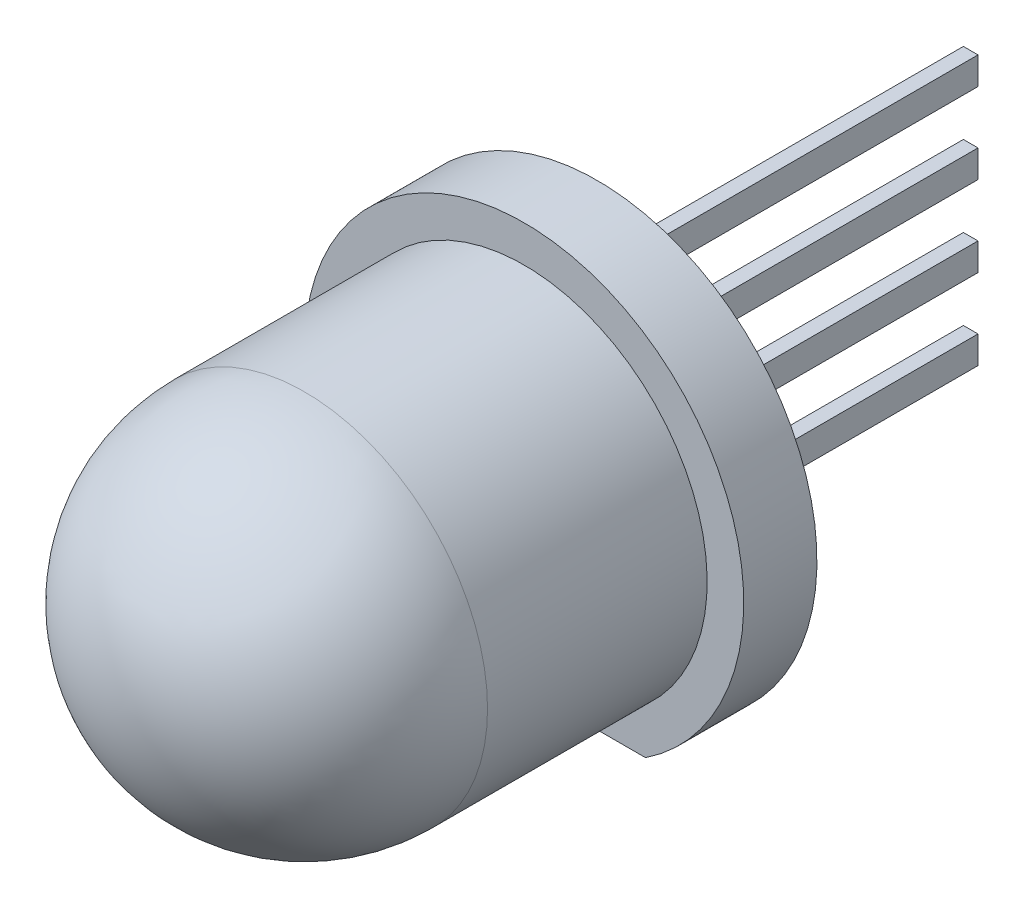
ISO-10303-21;
HEADER;
FILE_DESCRIPTION(('STEP AP214'),'2;1');
FILE_NAME('part.step','',(''),(''),'','','');
FILE_SCHEMA(('AUTOMOTIVE_DESIGN { 1 0 10303 214 1 1 1 1 }'));
ENDSEC;
DATA;
#1=APPLICATION_CONTEXT('core data for automotive mechanical design processes');
#2=APPLICATION_PROTOCOL_DEFINITION('international standard','automotive_design',2000,#1);
#3=PRODUCT_CONTEXT('',#1,'mechanical');
#4=PRODUCT('Part','Part','',(#3));
#5=PRODUCT_RELATED_PRODUCT_CATEGORY('part','',(#4));
#6=PRODUCT_DEFINITION_FORMATION('','',#4);
#7=PRODUCT_DEFINITION_CONTEXT('part definition',#1,'design');
#8=PRODUCT_DEFINITION('design','',#6,#7);
#9=PRODUCT_DEFINITION_SHAPE('','',#8);
#10=(LENGTH_UNIT() NAMED_UNIT(*) SI_UNIT(.MILLI.,.METRE.));
#11=(NAMED_UNIT(*) PLANE_ANGLE_UNIT() SI_UNIT($,.RADIAN.));
#12=(NAMED_UNIT(*) SI_UNIT($,.STERADIAN.) SOLID_ANGLE_UNIT());
#13=UNCERTAINTY_MEASURE_WITH_UNIT(LENGTH_MEASURE(1.E-05),#10,'distance_accuracy_value','');
#14=(GEOMETRIC_REPRESENTATION_CONTEXT(3) GLOBAL_UNCERTAINTY_ASSIGNED_CONTEXT((#13)) GLOBAL_UNIT_ASSIGNED_CONTEXT((#10,
#11,#12)) REPRESENTATION_CONTEXT('',''));
#15=CARTESIAN_POINT('',(0.,0.,0.));
#16=DIRECTION('',(0.,0.,1.));
#17=DIRECTION('',(1.,0.,0.));
#18=AXIS2_PLACEMENT_3D('',#15,#16,#17);
#19=CARTESIAN_POINT('',(0.4,-2.43182394241055,-12.));
#20=DIRECTION('',(-1.,0.,0.));
#21=DIRECTION('',(0.,0.,1.));
#22=AXIS2_PLACEMENT_3D('',#19,#20,#21);
#23=PLANE('',#22);
#24=DIRECTION('',(0.,-1.,0.));
#25=VECTOR('',#24,1.);
#26=CARTESIAN_POINT('',(0.4,-2.43182394241055,-2.));
#27=LINE('',#26,#25);
#28=CARTESIAN_POINT('',(0.4,-2.43182394241055,-2.));
#29=VERTEX_POINT('',#28);
#30=CARTESIAN_POINT('',(0.4,-3.18182394241055,-2.));
#31=VERTEX_POINT('',#30);
#32=EDGE_CURVE('E107',#29,#31,#27,.T.);
#33=ORIENTED_EDGE('',*,*,#32,.T.);
#34=DIRECTION('',(0.,0.,1.));
#35=VECTOR('',#34,1.);
#36=CARTESIAN_POINT('',(0.4,-3.18182394241055,-12.));
#37=LINE('',#36,#35);
#38=CARTESIAN_POINT('',(0.4,-3.18182394241055,-12.));
#39=VERTEX_POINT('',#38);
#40=EDGE_CURVE('E12',#39,#31,#37,.T.);
#41=ORIENTED_EDGE('',*,*,#40,.F.);
#42=DIRECTION('',(0.,-1.,0.));
#43=VECTOR('',#42,1.);
#44=CARTESIAN_POINT('',(0.4,-2.43182394241055,-12.));
#45=LINE('',#44,#43);
#46=CARTESIAN_POINT('',(0.4,-2.43182394241055,-12.));
#47=VERTEX_POINT('',#46);
#48=EDGE_CURVE('E95',#47,#39,#45,.T.);
#49=ORIENTED_EDGE('',*,*,#48,.F.);
#50=DIRECTION('',(0.,0.,1.));
#51=VECTOR('',#50,1.);
#52=CARTESIAN_POINT('',(0.4,-2.43182394241055,-12.));
#53=LINE('',#52,#51);
#54=EDGE_CURVE('E103',#47,#29,#53,.T.);
#55=ORIENTED_EDGE('',*,*,#54,.T.);
#56=EDGE_LOOP('',(#33,#41,#49,#55));
#57=FACE_BOUND('',#56,.T.);
#58=ADVANCED_FACE('F44',(#57),#23,.F.);
#59=CARTESIAN_POINT('',(0.4,-3.18182394241055,-12.));
#60=DIRECTION('',(0.,1.,0.));
#61=DIRECTION('',(0.,0.,1.));
#62=AXIS2_PLACEMENT_3D('',#59,#60,#61);
#63=PLANE('',#62);
#64=DIRECTION('',(-1.,0.,0.));
#65=VECTOR('',#64,1.);
#66=CARTESIAN_POINT('',(0.4,-3.18182394241055,-2.));
#67=LINE('',#66,#65);
#68=CARTESIAN_POINT('',(0.,-3.18182394241055,-2.));
#69=VERTEX_POINT('',#68);
#70=EDGE_CURVE('E99',#31,#69,#67,.T.);
#71=ORIENTED_EDGE('',*,*,#70,.T.);
#72=DIRECTION('',(0.,0.,1.));
#73=VECTOR('',#72,1.);
#74=CARTESIAN_POINT('',(0.,-3.18182394241055,-12.));
#75=LINE('',#74,#73);
#76=CARTESIAN_POINT('',(0.,-3.18182394241055,-12.));
#77=VERTEX_POINT('',#76);
#78=EDGE_CURVE('E52',#77,#69,#75,.T.);
#79=ORIENTED_EDGE('',*,*,#78,.F.);
#80=DIRECTION('',(-1.,0.,0.));
#81=VECTOR('',#80,1.);
#82=CARTESIAN_POINT('',(0.4,-3.18182394241055,-12.));
#83=LINE('',#82,#81);
#84=EDGE_CURVE('E90',#39,#77,#83,.T.);
#85=ORIENTED_EDGE('',*,*,#84,.F.);
#86=ORIENTED_EDGE('',*,*,#40,.T.);
#87=EDGE_LOOP('',(#71,#79,#85,#86));
#88=FACE_BOUND('',#87,.T.);
#89=ADVANCED_FACE('F98',(#88),#63,.F.);
#90=CARTESIAN_POINT('',(0.,-2.43182394241055,-12.));
#91=DIRECTION('',(1.,0.,0.));
#92=DIRECTION('',(0.,0.,-1.));
#93=AXIS2_PLACEMENT_3D('',#90,#91,#92);
#94=PLANE('',#93);
#95=DIRECTION('',(0.,1.,0.));
#96=VECTOR('',#95,1.);
#97=CARTESIAN_POINT('',(0.,-2.43182394241055,-2.));
#98=LINE('',#97,#96);
#99=CARTESIAN_POINT('',(0.,-2.43182394241055,-2.));
#100=VERTEX_POINT('',#99);
#101=EDGE_CURVE('E77',#69,#100,#98,.T.);
#102=ORIENTED_EDGE('',*,*,#101,.T.);
#103=DIRECTION('',(0.,0.,1.));
#104=VECTOR('',#103,1.);
#105=CARTESIAN_POINT('',(0.,-2.43182394241055,-12.));
#106=LINE('',#105,#104);
#107=CARTESIAN_POINT('',(0.,-2.43182394241055,-12.));
#108=VERTEX_POINT('',#107);
#109=EDGE_CURVE('E100',#108,#100,#106,.T.);
#110=ORIENTED_EDGE('',*,*,#109,.F.);
#111=DIRECTION('',(0.,1.,0.));
#112=VECTOR('',#111,1.);
#113=CARTESIAN_POINT('',(0.,-2.43182394241055,-12.));
#114=LINE('',#113,#112);
#115=EDGE_CURVE('E93',#77,#108,#114,.T.);
#116=ORIENTED_EDGE('',*,*,#115,.F.);
#117=ORIENTED_EDGE('',*,*,#78,.T.);
#118=EDGE_LOOP('',(#102,#110,#116,#117));
#119=FACE_BOUND('',#118,.T.);
#120=ADVANCED_FACE('F101',(#119),#94,.F.);
#121=CARTESIAN_POINT('',(0.4,-2.43182394241055,-12.));
#122=DIRECTION('',(0.,-1.,0.));
#123=DIRECTION('',(0.,0.,-1.));
#124=AXIS2_PLACEMENT_3D('',#121,#122,#123);
#125=PLANE('',#124);
#126=DIRECTION('',(1.,0.,0.));
#127=VECTOR('',#126,1.);
#128=CARTESIAN_POINT('',(0.4,-2.43182394241055,-2.));
#129=LINE('',#128,#127);
#130=EDGE_CURVE('E83',#100,#29,#129,.T.);
#131=ORIENTED_EDGE('',*,*,#130,.T.);
#132=ORIENTED_EDGE('',*,*,#54,.F.);
#133=DIRECTION('',(1.,0.,0.));
#134=VECTOR('',#133,1.);
#135=CARTESIAN_POINT('',(0.4,-2.43182394241055,-12.));
#136=LINE('',#135,#134);
#137=EDGE_CURVE('E60',#108,#47,#136,.T.);
#138=ORIENTED_EDGE('',*,*,#137,.F.);
#139=ORIENTED_EDGE('',*,*,#109,.T.);
#140=EDGE_LOOP('',(#131,#132,#138,#139));
#141=FACE_BOUND('',#140,.T.);
#142=ADVANCED_FACE('F114',(#141),#125,.F.);
#143=CARTESIAN_POINT('',(0.,0.,-12.));
#144=DIRECTION('',(0.,0.,-1.));
#145=DIRECTION('',(-1.,0.,0.));
#146=AXIS2_PLACEMENT_3D('',#143,#144,#145);
#147=PLANE('',#146);
#148=ORIENTED_EDGE('',*,*,#48,.T.);
#149=ORIENTED_EDGE('',*,*,#84,.T.);
#150=ORIENTED_EDGE('',*,*,#115,.T.);
#151=ORIENTED_EDGE('',*,*,#137,.T.);
#152=EDGE_LOOP('',(#148,#149,#150,#151));
#153=FACE_BOUND('',#152,.T.);
#154=ADVANCED_FACE('F91',(#153),#147,.T.);
#155=CARTESIAN_POINT('',(0.,0.,-2.));
#156=DIRECTION('',(0.,0.,-1.));
#157=DIRECTION('',(-1.,0.,0.));
#158=AXIS2_PLACEMENT_3D('',#155,#156,#157);
#159=PLANE('',#158);
#160=ORIENTED_EDGE('',*,*,#32,.F.);
#161=ORIENTED_EDGE('',*,*,#130,.F.);
#162=ORIENTED_EDGE('',*,*,#101,.F.);
#163=ORIENTED_EDGE('',*,*,#70,.F.);
#164=EDGE_LOOP('',(#160,#161,#162,#163));
#165=FACE_BOUND('',#164,.T.);
#166=ADVANCED_FACE('F117',(#165),#159,.F.);
#167=CLOSED_SHELL('',(#58,#89,#120,#142,#154,#166));
#168=MANIFOLD_SOLID_BREP('B2',#167);
#169=CARTESIAN_POINT('',(0.4,-0.230930300584403,-12.));
#170=DIRECTION('',(-1.,0.,0.));
#171=DIRECTION('',(0.,0.,1.));
#172=AXIS2_PLACEMENT_3D('',#169,#170,#171);
#173=PLANE('',#172);
#174=DIRECTION('',(0.,-1.,0.));
#175=VECTOR('',#174,1.);
#176=CARTESIAN_POINT('',(0.4,-0.230930300584403,-2.));
#177=LINE('',#176,#175);
#178=CARTESIAN_POINT('',(0.4,-0.230930300584403,-2.));
#179=VERTEX_POINT('',#178);
#180=CARTESIAN_POINT('',(0.4,-0.980930300584403,-2.));
#181=VERTEX_POINT('',#180);
#182=EDGE_CURVE('E241',#179,#181,#177,.T.);
#183=ORIENTED_EDGE('',*,*,#182,.T.);
#184=DIRECTION('',(0.,0.,1.));
#185=VECTOR('',#184,1.);
#186=CARTESIAN_POINT('',(0.4,-0.980930300584403,-12.));
#187=LINE('',#186,#185);
#188=CARTESIAN_POINT('',(0.4,-0.980930300584403,-12.));
#189=VERTEX_POINT('',#188);
#190=EDGE_CURVE('E42',#189,#181,#187,.T.);
#191=ORIENTED_EDGE('',*,*,#190,.F.);
#192=DIRECTION('',(0.,-1.,0.));
#193=VECTOR('',#192,1.);
#194=CARTESIAN_POINT('',(0.4,-0.230930300584403,-12.));
#195=LINE('',#194,#193);
#196=CARTESIAN_POINT('',(0.4,-0.230930300584403,-12.));
#197=VERTEX_POINT('',#196);
#198=EDGE_CURVE('E229',#197,#189,#195,.T.);
#199=ORIENTED_EDGE('',*,*,#198,.F.);
#200=DIRECTION('',(0.,0.,1.));
#201=VECTOR('',#200,1.);
#202=CARTESIAN_POINT('',(0.4,-0.230930300584403,-12.));
#203=LINE('',#202,#201);
#204=EDGE_CURVE('E237',#197,#179,#203,.T.);
#205=ORIENTED_EDGE('',*,*,#204,.T.);
#206=EDGE_LOOP('',(#183,#191,#199,#205));
#207=FACE_BOUND('',#206,.T.);
#208=ADVANCED_FACE('F178',(#207),#173,.F.);
#209=CARTESIAN_POINT('',(0.4,-0.980930300584403,-12.));
#210=DIRECTION('',(0.,1.,0.));
#211=DIRECTION('',(0.,0.,1.));
#212=AXIS2_PLACEMENT_3D('',#209,#210,#211);
#213=PLANE('',#212);
#214=DIRECTION('',(-1.,0.,0.));
#215=VECTOR('',#214,1.);
#216=CARTESIAN_POINT('',(0.4,-0.980930300584403,-2.));
#217=LINE('',#216,#215);
#218=CARTESIAN_POINT('',(0.,-0.980930300584403,-2.));
#219=VERTEX_POINT('',#218);
#220=EDGE_CURVE('E233',#181,#219,#217,.T.);
#221=ORIENTED_EDGE('',*,*,#220,.T.);
#222=DIRECTION('',(0.,0.,1.));
#223=VECTOR('',#222,1.);
#224=CARTESIAN_POINT('',(0.,-0.980930300584403,-12.));
#225=LINE('',#224,#223);
#226=CARTESIAN_POINT('',(0.,-0.980930300584403,-12.));
#227=VERTEX_POINT('',#226);
#228=EDGE_CURVE('E186',#227,#219,#225,.T.);
#229=ORIENTED_EDGE('',*,*,#228,.F.);
#230=DIRECTION('',(-1.,0.,0.));
#231=VECTOR('',#230,1.);
#232=CARTESIAN_POINT('',(0.4,-0.980930300584403,-12.));
#233=LINE('',#232,#231);
#234=EDGE_CURVE('E224',#189,#227,#233,.T.);
#235=ORIENTED_EDGE('',*,*,#234,.F.);
#236=ORIENTED_EDGE('',*,*,#190,.T.);
#237=EDGE_LOOP('',(#221,#229,#235,#236));
#238=FACE_BOUND('',#237,.T.);
#239=ADVANCED_FACE('F232',(#238),#213,.F.);
#240=CARTESIAN_POINT('',(0.,-0.230930300584403,-12.));
#241=DIRECTION('',(1.,0.,0.));
#242=DIRECTION('',(0.,0.,-1.));
#243=AXIS2_PLACEMENT_3D('',#240,#241,#242);
#244=PLANE('',#243);
#245=DIRECTION('',(0.,1.,0.));
#246=VECTOR('',#245,1.);
#247=CARTESIAN_POINT('',(0.,-0.230930300584403,-2.));
#248=LINE('',#247,#246);
#249=CARTESIAN_POINT('',(0.,-0.230930300584403,-2.));
#250=VERTEX_POINT('',#249);
#251=EDGE_CURVE('E211',#219,#250,#248,.T.);
#252=ORIENTED_EDGE('',*,*,#251,.T.);
#253=DIRECTION('',(0.,0.,1.));
#254=VECTOR('',#253,1.);
#255=CARTESIAN_POINT('',(0.,-0.230930300584403,-12.));
#256=LINE('',#255,#254);
#257=CARTESIAN_POINT('',(0.,-0.230930300584403,-12.));
#258=VERTEX_POINT('',#257);
#259=EDGE_CURVE('E234',#258,#250,#256,.T.);
#260=ORIENTED_EDGE('',*,*,#259,.F.);
#261=DIRECTION('',(0.,1.,0.));
#262=VECTOR('',#261,1.);
#263=CARTESIAN_POINT('',(0.,-0.230930300584403,-12.));
#264=LINE('',#263,#262);
#265=EDGE_CURVE('E227',#227,#258,#264,.T.);
#266=ORIENTED_EDGE('',*,*,#265,.F.);
#267=ORIENTED_EDGE('',*,*,#228,.T.);
#268=EDGE_LOOP('',(#252,#260,#266,#267));
#269=FACE_BOUND('',#268,.T.);
#270=ADVANCED_FACE('F235',(#269),#244,.F.);
#271=CARTESIAN_POINT('',(0.4,-0.230930300584403,-12.));
#272=DIRECTION('',(0.,-1.,0.));
#273=DIRECTION('',(0.,0.,-1.));
#274=AXIS2_PLACEMENT_3D('',#271,#272,#273);
#275=PLANE('',#274);
#276=DIRECTION('',(1.,0.,0.));
#277=VECTOR('',#276,1.);
#278=CARTESIAN_POINT('',(0.4,-0.230930300584403,-2.));
#279=LINE('',#278,#277);
#280=EDGE_CURVE('E217',#250,#179,#279,.T.);
#281=ORIENTED_EDGE('',*,*,#280,.T.);
#282=ORIENTED_EDGE('',*,*,#204,.F.);
#283=DIRECTION('',(1.,0.,0.));
#284=VECTOR('',#283,1.);
#285=CARTESIAN_POINT('',(0.4,-0.230930300584403,-12.));
#286=LINE('',#285,#284);
#287=EDGE_CURVE('E194',#258,#197,#286,.T.);
#288=ORIENTED_EDGE('',*,*,#287,.F.);
#289=ORIENTED_EDGE('',*,*,#259,.T.);
#290=EDGE_LOOP('',(#281,#282,#288,#289));
#291=FACE_BOUND('',#290,.T.);
#292=ADVANCED_FACE('F248',(#291),#275,.F.);
#293=CARTESIAN_POINT('',(0.,0.,-12.));
#294=DIRECTION('',(0.,0.,-1.));
#295=DIRECTION('',(-1.,0.,0.));
#296=AXIS2_PLACEMENT_3D('',#293,#294,#295);
#297=PLANE('',#296);
#298=ORIENTED_EDGE('',*,*,#198,.T.);
#299=ORIENTED_EDGE('',*,*,#234,.T.);
#300=ORIENTED_EDGE('',*,*,#265,.T.);
#301=ORIENTED_EDGE('',*,*,#287,.T.);
#302=EDGE_LOOP('',(#298,#299,#300,#301));
#303=FACE_BOUND('',#302,.T.);
#304=ADVANCED_FACE('F225',(#303),#297,.T.);
#305=CARTESIAN_POINT('',(0.,0.,-2.));
#306=DIRECTION('',(0.,0.,-1.));
#307=DIRECTION('',(-1.,0.,0.));
#308=AXIS2_PLACEMENT_3D('',#305,#306,#307);
#309=PLANE('',#308);
#310=ORIENTED_EDGE('',*,*,#182,.F.);
#311=ORIENTED_EDGE('',*,*,#280,.F.);
#312=ORIENTED_EDGE('',*,*,#251,.F.);
#313=ORIENTED_EDGE('',*,*,#220,.F.);
#314=EDGE_LOOP('',(#310,#311,#312,#313));
#315=FACE_BOUND('',#314,.T.);
#316=ADVANCED_FACE('F251',(#315),#309,.F.);
#317=CLOSED_SHELL('',(#208,#239,#270,#292,#304,#316));
#318=MANIFOLD_SOLID_BREP('B6',#317);
#319=CARTESIAN_POINT('',(0.4,1.96996334124174,-12.));
#320=DIRECTION('',(-1.,0.,0.));
#321=DIRECTION('',(0.,0.,1.));
#322=AXIS2_PLACEMENT_3D('',#319,#320,#321);
#323=PLANE('',#322);
#324=DIRECTION('',(0.,-1.,0.));
#325=VECTOR('',#324,1.);
#326=CARTESIAN_POINT('',(0.4,1.96996334124174,-2.));
#327=LINE('',#326,#325);
#328=CARTESIAN_POINT('',(0.4,1.96996334124174,-2.));
#329=VERTEX_POINT('',#328);
#330=CARTESIAN_POINT('',(0.4,1.21996334124174,-2.));
#331=VERTEX_POINT('',#330);
#332=EDGE_CURVE('E375',#329,#331,#327,.T.);
#333=ORIENTED_EDGE('',*,*,#332,.T.);
#334=DIRECTION('',(0.,0.,1.));
#335=VECTOR('',#334,1.);
#336=CARTESIAN_POINT('',(0.4,1.21996334124174,-12.));
#337=LINE('',#336,#335);
#338=CARTESIAN_POINT('',(0.4,1.21996334124174,-12.));
#339=VERTEX_POINT('',#338);
#340=EDGE_CURVE('E176',#339,#331,#337,.T.);
#341=ORIENTED_EDGE('',*,*,#340,.F.);
#342=DIRECTION('',(0.,-1.,0.));
#343=VECTOR('',#342,1.);
#344=CARTESIAN_POINT('',(0.4,1.96996334124174,-12.));
#345=LINE('',#344,#343);
#346=CARTESIAN_POINT('',(0.4,1.96996334124174,-12.));
#347=VERTEX_POINT('',#346);
#348=EDGE_CURVE('E363',#347,#339,#345,.T.);
#349=ORIENTED_EDGE('',*,*,#348,.F.);
#350=DIRECTION('',(0.,0.,1.));
#351=VECTOR('',#350,1.);
#352=CARTESIAN_POINT('',(0.4,1.96996334124174,-12.));
#353=LINE('',#352,#351);
#354=EDGE_CURVE('E371',#347,#329,#353,.T.);
#355=ORIENTED_EDGE('',*,*,#354,.T.);
#356=EDGE_LOOP('',(#333,#341,#349,#355));
#357=FACE_BOUND('',#356,.T.);
#358=ADVANCED_FACE('F312',(#357),#323,.F.);
#359=CARTESIAN_POINT('',(0.4,1.21996334124174,-12.));
#360=DIRECTION('',(0.,1.,0.));
#361=DIRECTION('',(0.,0.,1.));
#362=AXIS2_PLACEMENT_3D('',#359,#360,#361);
#363=PLANE('',#362);
#364=DIRECTION('',(-1.,0.,0.));
#365=VECTOR('',#364,1.);
#366=CARTESIAN_POINT('',(0.4,1.21996334124174,-2.));
#367=LINE('',#366,#365);
#368=CARTESIAN_POINT('',(0.,1.21996334124174,-2.));
#369=VERTEX_POINT('',#368);
#370=EDGE_CURVE('E367',#331,#369,#367,.T.);
#371=ORIENTED_EDGE('',*,*,#370,.T.);
#372=DIRECTION('',(0.,0.,1.));
#373=VECTOR('',#372,1.);
#374=CARTESIAN_POINT('',(0.,1.21996334124174,-12.));
#375=LINE('',#374,#373);
#376=CARTESIAN_POINT('',(0.,1.21996334124174,-12.));
#377=VERTEX_POINT('',#376);
#378=EDGE_CURVE('E320',#377,#369,#375,.T.);
#379=ORIENTED_EDGE('',*,*,#378,.F.);
#380=DIRECTION('',(-1.,0.,0.));
#381=VECTOR('',#380,1.);
#382=CARTESIAN_POINT('',(0.4,1.21996334124174,-12.));
#383=LINE('',#382,#381);
#384=EDGE_CURVE('E358',#339,#377,#383,.T.);
#385=ORIENTED_EDGE('',*,*,#384,.F.);
#386=ORIENTED_EDGE('',*,*,#340,.T.);
#387=EDGE_LOOP('',(#371,#379,#385,#386));
#388=FACE_BOUND('',#387,.T.);
#389=ADVANCED_FACE('F366',(#388),#363,.F.);
#390=CARTESIAN_POINT('',(0.,1.96996334124174,-12.));
#391=DIRECTION('',(1.,0.,0.));
#392=DIRECTION('',(0.,0.,-1.));
#393=AXIS2_PLACEMENT_3D('',#390,#391,#392);
#394=PLANE('',#393);
#395=DIRECTION('',(0.,1.,0.));
#396=VECTOR('',#395,1.);
#397=CARTESIAN_POINT('',(0.,1.96996334124174,-2.));
#398=LINE('',#397,#396);
#399=CARTESIAN_POINT('',(0.,1.96996334124174,-2.));
#400=VERTEX_POINT('',#399);
#401=EDGE_CURVE('E345',#369,#400,#398,.T.);
#402=ORIENTED_EDGE('',*,*,#401,.T.);
#403=DIRECTION('',(0.,0.,1.));
#404=VECTOR('',#403,1.);
#405=CARTESIAN_POINT('',(0.,1.96996334124174,-12.));
#406=LINE('',#405,#404);
#407=CARTESIAN_POINT('',(0.,1.96996334124174,-12.));
#408=VERTEX_POINT('',#407);
#409=EDGE_CURVE('E368',#408,#400,#406,.T.);
#410=ORIENTED_EDGE('',*,*,#409,.F.);
#411=DIRECTION('',(0.,1.,0.));
#412=VECTOR('',#411,1.);
#413=CARTESIAN_POINT('',(0.,1.96996334124174,-12.));
#414=LINE('',#413,#412);
#415=EDGE_CURVE('E361',#377,#408,#414,.T.);
#416=ORIENTED_EDGE('',*,*,#415,.F.);
#417=ORIENTED_EDGE('',*,*,#378,.T.);
#418=EDGE_LOOP('',(#402,#410,#416,#417));
#419=FACE_BOUND('',#418,.T.);
#420=ADVANCED_FACE('F369',(#419),#394,.F.);
#421=CARTESIAN_POINT('',(0.4,1.96996334124174,-12.));
#422=DIRECTION('',(0.,-1.,0.));
#423=DIRECTION('',(0.,0.,-1.));
#424=AXIS2_PLACEMENT_3D('',#421,#422,#423);
#425=PLANE('',#424);
#426=DIRECTION('',(1.,0.,0.));
#427=VECTOR('',#426,1.);
#428=CARTESIAN_POINT('',(0.4,1.96996334124174,-2.));
#429=LINE('',#428,#427);
#430=EDGE_CURVE('E351',#400,#329,#429,.T.);
#431=ORIENTED_EDGE('',*,*,#430,.T.);
#432=ORIENTED_EDGE('',*,*,#354,.F.);
#433=DIRECTION('',(1.,0.,0.));
#434=VECTOR('',#433,1.);
#435=CARTESIAN_POINT('',(0.4,1.96996334124174,-12.));
#436=LINE('',#435,#434);
#437=EDGE_CURVE('E328',#408,#347,#436,.T.);
#438=ORIENTED_EDGE('',*,*,#437,.F.);
#439=ORIENTED_EDGE('',*,*,#409,.T.);
#440=EDGE_LOOP('',(#431,#432,#438,#439));
#441=FACE_BOUND('',#440,.T.);
#442=ADVANCED_FACE('F382',(#441),#425,.F.);
#443=CARTESIAN_POINT('',(0.,0.,-12.));
#444=DIRECTION('',(0.,0.,-1.));
#445=DIRECTION('',(-1.,0.,0.));
#446=AXIS2_PLACEMENT_3D('',#443,#444,#445);
#447=PLANE('',#446);
#448=ORIENTED_EDGE('',*,*,#348,.T.);
#449=ORIENTED_EDGE('',*,*,#384,.T.);
#450=ORIENTED_EDGE('',*,*,#415,.T.);
#451=ORIENTED_EDGE('',*,*,#437,.T.);
#452=EDGE_LOOP('',(#448,#449,#450,#451));
#453=FACE_BOUND('',#452,.T.);
#454=ADVANCED_FACE('F359',(#453),#447,.T.);
#455=CARTESIAN_POINT('',(0.,0.,-2.));
#456=DIRECTION('',(0.,0.,-1.));
#457=DIRECTION('',(-1.,0.,0.));
#458=AXIS2_PLACEMENT_3D('',#455,#456,#457);
#459=PLANE('',#458);
#460=ORIENTED_EDGE('',*,*,#332,.F.);
#461=ORIENTED_EDGE('',*,*,#430,.F.);
#462=ORIENTED_EDGE('',*,*,#401,.F.);
#463=ORIENTED_EDGE('',*,*,#370,.F.);
#464=EDGE_LOOP('',(#460,#461,#462,#463));
#465=FACE_BOUND('',#464,.T.);
#466=ADVANCED_FACE('F385',(#465),#459,.F.);
#467=CLOSED_SHELL('',(#358,#389,#420,#442,#454,#466));
#468=MANIFOLD_SOLID_BREP('B36',#467);
#469=CARTESIAN_POINT('',(0.4,4.17085698306788,-12.));
#470=DIRECTION('',(-1.,0.,0.));
#471=DIRECTION('',(0.,0.,1.));
#472=AXIS2_PLACEMENT_3D('',#469,#470,#471);
#473=PLANE('',#472);
#474=DIRECTION('',(0.,-1.,0.));
#475=VECTOR('',#474,1.);
#476=CARTESIAN_POINT('',(0.4,4.17085698306788,-2.));
#477=LINE('',#476,#475);
#478=CARTESIAN_POINT('',(0.4,4.17085698306788,-2.));
#479=VERTEX_POINT('',#478);
#480=CARTESIAN_POINT('',(0.4,3.42085698306788,-2.));
#481=VERTEX_POINT('',#480);
#482=EDGE_CURVE('E508',#479,#481,#477,.T.);
#483=ORIENTED_EDGE('',*,*,#482,.T.);
#484=DIRECTION('',(0.,0.,1.));
#485=VECTOR('',#484,1.);
#486=CARTESIAN_POINT('',(0.4,3.42085698306788,-12.));
#487=LINE('',#486,#485);
#488=CARTESIAN_POINT('',(0.4,3.42085698306788,-12.));
#489=VERTEX_POINT('',#488);
#490=EDGE_CURVE('E310',#489,#481,#487,.T.);
#491=ORIENTED_EDGE('',*,*,#490,.F.);
#492=DIRECTION('',(0.,-1.,0.));
#493=VECTOR('',#492,1.);
#494=CARTESIAN_POINT('',(0.4,4.17085698306788,-12.));
#495=LINE('',#494,#493);
#496=CARTESIAN_POINT('',(0.4,4.17085698306788,-12.));
#497=VERTEX_POINT('',#496);
#498=EDGE_CURVE('E496',#497,#489,#495,.T.);
#499=ORIENTED_EDGE('',*,*,#498,.F.);
#500=DIRECTION('',(0.,0.,1.));
#501=VECTOR('',#500,1.);
#502=CARTESIAN_POINT('',(0.4,4.17085698306788,-12.));
#503=LINE('',#502,#501);
#504=EDGE_CURVE('E504',#497,#479,#503,.T.);
#505=ORIENTED_EDGE('',*,*,#504,.T.);
#506=EDGE_LOOP('',(#483,#491,#499,#505));
#507=FACE_BOUND('',#506,.T.);
#508=ADVANCED_FACE('F445',(#507),#473,.F.);
#509=CARTESIAN_POINT('',(0.4,3.42085698306788,-12.));
#510=DIRECTION('',(0.,1.,0.));
#511=DIRECTION('',(0.,0.,1.));
#512=AXIS2_PLACEMENT_3D('',#509,#510,#511);
#513=PLANE('',#512);
#514=DIRECTION('',(-1.,0.,0.));
#515=VECTOR('',#514,1.);
#516=CARTESIAN_POINT('',(0.4,3.42085698306788,-2.));
#517=LINE('',#516,#515);
#518=CARTESIAN_POINT('',(0.,3.42085698306788,-2.));
#519=VERTEX_POINT('',#518);
#520=EDGE_CURVE('E500',#481,#519,#517,.T.);
#521=ORIENTED_EDGE('',*,*,#520,.T.);
#522=DIRECTION('',(0.,0.,1.));
#523=VECTOR('',#522,1.);
#524=CARTESIAN_POINT('',(0.,3.42085698306788,-12.));
#525=LINE('',#524,#523);
#526=CARTESIAN_POINT('',(0.,3.42085698306788,-12.));
#527=VERTEX_POINT('',#526);
#528=EDGE_CURVE('E453',#527,#519,#525,.T.);
#529=ORIENTED_EDGE('',*,*,#528,.F.);
#530=DIRECTION('',(-1.,0.,0.));
#531=VECTOR('',#530,1.);
#532=CARTESIAN_POINT('',(0.4,3.42085698306788,-12.));
#533=LINE('',#532,#531);
#534=EDGE_CURVE('E491',#489,#527,#533,.T.);
#535=ORIENTED_EDGE('',*,*,#534,.F.);
#536=ORIENTED_EDGE('',*,*,#490,.T.);
#537=EDGE_LOOP('',(#521,#529,#535,#536));
#538=FACE_BOUND('',#537,.T.);
#539=ADVANCED_FACE('F499',(#538),#513,.F.);
#540=CARTESIAN_POINT('',(0.,4.17085698306788,-12.));
#541=DIRECTION('',(1.,0.,0.));
#542=DIRECTION('',(0.,1.,0.));
#543=AXIS2_PLACEMENT_3D('',#540,#541,#542);
#544=PLANE('',#543);
#545=DIRECTION('',(0.,1.,0.));
#546=VECTOR('',#545,1.);
#547=CARTESIAN_POINT('',(0.,4.17085698306788,-2.));
#548=LINE('',#547,#546);
#549=CARTESIAN_POINT('',(0.,4.17085698306788,-2.));
#550=VERTEX_POINT('',#549);
#551=EDGE_CURVE('E478',#519,#550,#548,.T.);
#552=ORIENTED_EDGE('',*,*,#551,.T.);
#553=DIRECTION('',(0.,0.,1.));
#554=VECTOR('',#553,1.);
#555=CARTESIAN_POINT('',(0.,4.17085698306788,-12.));
#556=LINE('',#555,#554);
#557=CARTESIAN_POINT('',(0.,4.17085698306788,-12.));
#558=VERTEX_POINT('',#557);
#559=EDGE_CURVE('E501',#558,#550,#556,.T.);
#560=ORIENTED_EDGE('',*,*,#559,.F.);
#561=DIRECTION('',(0.,1.,0.));
#562=VECTOR('',#561,1.);
#563=CARTESIAN_POINT('',(0.,4.17085698306788,-12.));
#564=LINE('',#563,#562);
#565=EDGE_CURVE('E494',#527,#558,#564,.T.);
#566=ORIENTED_EDGE('',*,*,#565,.F.);
#567=ORIENTED_EDGE('',*,*,#528,.T.);
#568=EDGE_LOOP('',(#552,#560,#566,#567));
#569=FACE_BOUND('',#568,.T.);
#570=ADVANCED_FACE('F502',(#569),#544,.F.);
#571=CARTESIAN_POINT('',(0.4,4.17085698306788,-12.));
#572=DIRECTION('',(0.,-1.,0.));
#573=DIRECTION('',(1.,0.,0.));
#574=AXIS2_PLACEMENT_3D('',#571,#572,#573);
#575=PLANE('',#574);
#576=DIRECTION('',(1.,0.,0.));
#577=VECTOR('',#576,1.);
#578=CARTESIAN_POINT('',(0.4,4.17085698306788,-2.));
#579=LINE('',#578,#577);
#580=EDGE_CURVE('E484',#550,#479,#579,.T.);
#581=ORIENTED_EDGE('',*,*,#580,.T.);
#582=ORIENTED_EDGE('',*,*,#504,.F.);
#583=DIRECTION('',(1.,0.,0.));
#584=VECTOR('',#583,1.);
#585=CARTESIAN_POINT('',(0.4,4.17085698306788,-12.));
#586=LINE('',#585,#584);
#587=EDGE_CURVE('E461',#558,#497,#586,.T.);
#588=ORIENTED_EDGE('',*,*,#587,.F.);
#589=ORIENTED_EDGE('',*,*,#559,.T.);
#590=EDGE_LOOP('',(#581,#582,#588,#589));
#591=FACE_BOUND('',#590,.T.);
#592=ADVANCED_FACE('F515',(#591),#575,.F.);
#593=CARTESIAN_POINT('',(0.,0.,-12.));
#594=DIRECTION('',(0.,0.,-1.));
#595=DIRECTION('',(-1.,0.,0.));
#596=AXIS2_PLACEMENT_3D('',#593,#594,#595);
#597=PLANE('',#596);
#598=ORIENTED_EDGE('',*,*,#498,.T.);
#599=ORIENTED_EDGE('',*,*,#534,.T.);
#600=ORIENTED_EDGE('',*,*,#565,.T.);
#601=ORIENTED_EDGE('',*,*,#587,.T.);
#602=EDGE_LOOP('',(#598,#599,#600,#601));
#603=FACE_BOUND('',#602,.T.);
#604=ADVANCED_FACE('F492',(#603),#597,.T.);
#605=CARTESIAN_POINT('',(0.,0.,-2.));
#606=DIRECTION('',(0.,0.,-1.));
#607=DIRECTION('',(-1.,0.,0.));
#608=AXIS2_PLACEMENT_3D('',#605,#606,#607);
#609=PLANE('',#608);
#610=ORIENTED_EDGE('',*,*,#482,.F.);
#611=ORIENTED_EDGE('',*,*,#580,.F.);
#612=ORIENTED_EDGE('',*,*,#551,.F.);
#613=ORIENTED_EDGE('',*,*,#520,.F.);
#614=EDGE_LOOP('',(#610,#611,#612,#613));
#615=FACE_BOUND('',#614,.T.);
#616=ADVANCED_FACE('F518',(#615),#609,.F.);
#617=CLOSED_SHELL('',(#508,#539,#570,#592,#604,#616));
#618=MANIFOLD_SOLID_BREP('B170',#617);
#619=CARTESIAN_POINT('',(0.,0.,6.));
#620=DIRECTION('',(0.,0.,-1.));
#621=DIRECTION('',(-1.,0.,0.));
#622=AXIS2_PLACEMENT_3D('',#619,#620,#621);
#623=CYLINDRICAL_SURFACE('',#622,5.);
#624=CARTESIAN_POINT('',(0.,0.,6.));
#625=DIRECTION('',(0.,0.,1.));
#626=DIRECTION('',(1.,0.,0.));
#627=AXIS2_PLACEMENT_3D('',#624,#625,#626);
#628=CIRCLE('',#627,5.);
#629=CARTESIAN_POINT('',(5.,0.,6.));
#630=VERTEX_POINT('',#629);
#631=EDGE_CURVE('E577',#630,#630,#628,.T.);
#632=ORIENTED_EDGE('',*,*,#631,.F.);
#633=EDGE_LOOP('',(#632));
#634=FACE_BOUND('',#633,.T.);
#635=CARTESIAN_POINT('',(0.,0.,0.));
#636=DIRECTION('',(0.,0.,-1.));
#637=DIRECTION('',(-1.,0.,0.));
#638=AXIS2_PLACEMENT_3D('',#635,#636,#637);
#639=CIRCLE('',#638,5.);
#640=CARTESIAN_POINT('',(0.,-5.,0.));
#641=VERTEX_POINT('',#640);
#642=EDGE_CURVE('E609',#641,#641,#639,.T.);
#643=ORIENTED_EDGE('',*,*,#642,.F.);
#644=EDGE_LOOP('',(#643));
#645=FACE_BOUND('',#644,.T.);
#646=ADVANCED_FACE('F569',(#634,#645),#623,.T.);
#647=CARTESIAN_POINT('',(0.,0.,6.));
#648=DIRECTION('',(0.,0.,1.));
#649=DIRECTION('',(1.,0.,0.));
#650=AXIS2_PLACEMENT_3D('',#647,#648,#649);
#651=SPHERICAL_SURFACE('',#650,5.);
#652=ORIENTED_EDGE('',*,*,#631,.T.);
#653=EDGE_LOOP('',(#652));
#654=FACE_BOUND('',#653,.T.);
#655=ADVANCED_FACE('F571',(#654),#651,.T.);
#656=CARTESIAN_POINT('',(0.,0.,0.));
#657=DIRECTION('',(0.,0.,-1.));
#658=DIRECTION('',(-1.,0.,0.));
#659=AXIS2_PLACEMENT_3D('',#656,#657,#658);
#660=PLANE('',#659);
#661=CARTESIAN_POINT('',(0.,0.,0.));
#662=DIRECTION('',(0.,0.,-1.));
#663=DIRECTION('',(-1.,0.,0.));
#664=AXIS2_PLACEMENT_3D('',#661,#662,#663);
#665=CIRCLE('',#664,6.);
#666=CARTESIAN_POINT('',(-3.3166247903554,-5.,0.));
#667=VERTEX_POINT('',#666);
#668=CARTESIAN_POINT('',(3.3166247903554,-5.,0.));
#669=VERTEX_POINT('',#668);
#670=EDGE_CURVE('E605',#667,#669,#665,.T.);
#671=ORIENTED_EDGE('',*,*,#670,.F.);
#672=DIRECTION('',(1.,0.,0.));
#673=VECTOR('',#672,1.);
#674=CARTESIAN_POINT('',(-8.26801233434082,-5.,0.));
#675=LINE('',#674,#673);
#676=EDGE_CURVE('E606',#667,#641,#675,.T.);
#677=ORIENTED_EDGE('',*,*,#676,.T.);
#678=ORIENTED_EDGE('',*,*,#642,.T.);
#679=EDGE_CURVE('E625',#641,#669,#675,.T.);
#680=ORIENTED_EDGE('',*,*,#679,.T.);
#681=EDGE_LOOP('',(#671,#677,#678,#680));
#682=FACE_BOUND('',#681,.T.);
#683=ADVANCED_FACE('F624',(#682),#660,.F.);
#684=CARTESIAN_POINT('',(0.,0.,-2.));
#685=DIRECTION('',(0.,0.,1.));
#686=DIRECTION('',(1.,0.,0.));
#687=AXIS2_PLACEMENT_3D('',#684,#685,#686);
#688=CYLINDRICAL_SURFACE('',#687,6.);
#689=CARTESIAN_POINT('',(0.,0.,-2.));
#690=DIRECTION('',(0.,0.,-1.));
#691=DIRECTION('',(-1.,0.,0.));
#692=AXIS2_PLACEMENT_3D('',#689,#690,#691);
#693=CIRCLE('',#692,6.);
#694=CARTESIAN_POINT('',(-3.3166247903554,-5.,-2.));
#695=VERTEX_POINT('',#694);
#696=CARTESIAN_POINT('',(3.3166247903554,-5.,-2.));
#697=VERTEX_POINT('',#696);
#698=EDGE_CURVE('E603',#695,#697,#693,.T.);
#699=ORIENTED_EDGE('',*,*,#698,.F.);
#700=DIRECTION('',(0.,0.,1.));
#701=VECTOR('',#700,1.);
#702=CARTESIAN_POINT('',(-3.3166247903554,-5.,-2.));
#703=LINE('',#702,#701);
#704=EDGE_CURVE('E583',#695,#667,#703,.T.);
#705=ORIENTED_EDGE('',*,*,#704,.T.);
#706=ORIENTED_EDGE('',*,*,#670,.T.);
#707=DIRECTION('',(0.,0.,1.));
#708=VECTOR('',#707,1.);
#709=CARTESIAN_POINT('',(3.3166247903554,-5.,-2.));
#710=LINE('',#709,#708);
#711=EDGE_CURVE('E589',#669,#697,#710,.F.);
#712=ORIENTED_EDGE('',*,*,#711,.T.);
#713=EDGE_LOOP('',(#699,#705,#706,#712));
#714=FACE_BOUND('',#713,.T.);
#715=ADVANCED_FACE('F602',(#714),#688,.T.);
#716=CARTESIAN_POINT('',(0.,0.,-2.));
#717=DIRECTION('',(0.,0.,-1.));
#718=DIRECTION('',(-1.,0.,0.));
#719=AXIS2_PLACEMENT_3D('',#716,#717,#718);
#720=PLANE('',#719);
#721=DIRECTION('',(1.,0.,0.));
#722=VECTOR('',#721,1.);
#723=CARTESIAN_POINT('',(0.,-5.,-2.));
#724=LINE('',#723,#722);
#725=EDGE_CURVE('E443',#695,#697,#724,.T.);
#726=ORIENTED_EDGE('',*,*,#725,.F.);
#727=ORIENTED_EDGE('',*,*,#698,.T.);
#728=EDGE_LOOP('',(#726,#727));
#729=FACE_BOUND('',#728,.T.);
#730=ADVANCED_FACE('F608',(#729),#720,.T.);
#731=CARTESIAN_POINT('',(-8.26801233434082,-5.,0.));
#732=DIRECTION('',(0.,1.,0.));
#733=DIRECTION('',(-1.,0.,0.));
#734=AXIS2_PLACEMENT_3D('',#731,#732,#733);
#735=PLANE('',#734);
#736=ORIENTED_EDGE('',*,*,#725,.T.);
#737=ORIENTED_EDGE('',*,*,#711,.F.);
#738=ORIENTED_EDGE('',*,*,#679,.F.);
#739=ORIENTED_EDGE('',*,*,#676,.F.);
#740=ORIENTED_EDGE('',*,*,#704,.F.);
#741=EDGE_LOOP('',(#736,#737,#738,#739,#740));
#742=FACE_BOUND('',#741,.T.);
#743=ADVANCED_FACE('F596',(#742),#735,.F.);
#744=CLOSED_SHELL('',(#646,#655,#683,#715,#730,#743));
#745=MANIFOLD_SOLID_BREP('B304',#744);
#746=ADVANCED_BREP_SHAPE_REPRESENTATION('',(#18,#168,#318,#468,#618,#745),#14);
#747=SHAPE_DEFINITION_REPRESENTATION(#9,#746);
ENDSEC;
END-ISO-10303-21;
